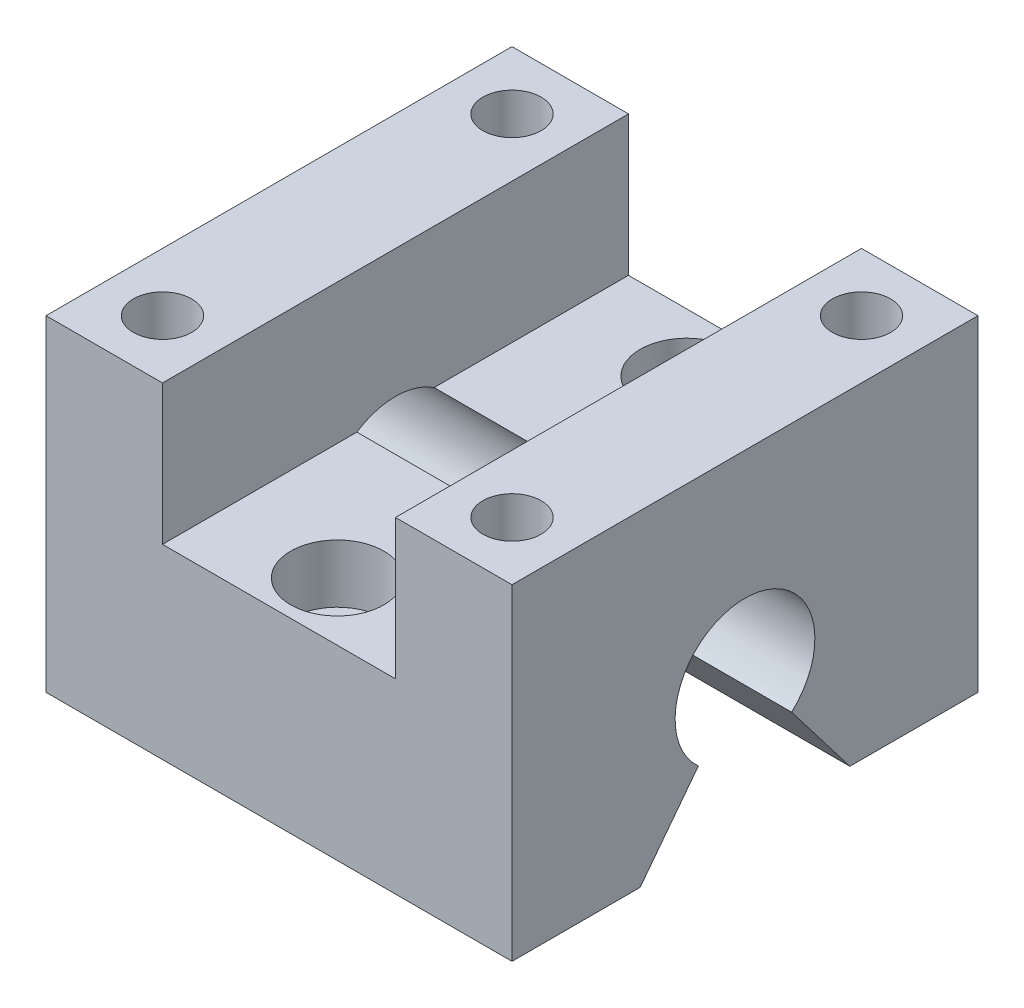
ISO-10303-21;
HEADER;
FILE_DESCRIPTION(('STEP AP214'),'2;1');
FILE_NAME('part.step','',(''),(''),'','','');
FILE_SCHEMA(('AUTOMOTIVE_DESIGN { 1 0 10303 214 1 1 1 1 }'));
ENDSEC;
DATA;
#1=APPLICATION_CONTEXT('core data for automotive mechanical design processes');
#2=APPLICATION_PROTOCOL_DEFINITION('international standard','automotive_design',2000,#1);
#3=PRODUCT_CONTEXT('',#1,'mechanical');
#4=PRODUCT('Part','Part','',(#3));
#5=PRODUCT_RELATED_PRODUCT_CATEGORY('part','',(#4));
#6=PRODUCT_DEFINITION_FORMATION('','',#4);
#7=PRODUCT_DEFINITION_CONTEXT('part definition',#1,'design');
#8=PRODUCT_DEFINITION('design','',#6,#7);
#9=PRODUCT_DEFINITION_SHAPE('','',#8);
#10=(LENGTH_UNIT() NAMED_UNIT(*) SI_UNIT(.MILLI.,.METRE.));
#11=(NAMED_UNIT(*) PLANE_ANGLE_UNIT() SI_UNIT($,.RADIAN.));
#12=(NAMED_UNIT(*) SI_UNIT($,.STERADIAN.) SOLID_ANGLE_UNIT());
#13=UNCERTAINTY_MEASURE_WITH_UNIT(LENGTH_MEASURE(1.E-05),#10,'distance_accuracy_value','');
#14=(GEOMETRIC_REPRESENTATION_CONTEXT(3) GLOBAL_UNCERTAINTY_ASSIGNED_CONTEXT((#13)) GLOBAL_UNIT_ASSIGNED_CONTEXT((#10,
#11,#12)) REPRESENTATION_CONTEXT('',''));
#15=CARTESIAN_POINT('',(0.,0.,0.));
#16=DIRECTION('',(0.,0.,1.));
#17=DIRECTION('',(1.,0.,0.));
#18=AXIS2_PLACEMENT_3D('',#15,#16,#17);
#19=CARTESIAN_POINT('',(20.,14.,20.));
#20=DIRECTION('',(0.,-1.,0.));
#21=DIRECTION('',(0.,0.,-1.));
#22=AXIS2_PLACEMENT_3D('',#19,#20,#21);
#23=PLANE('',#22);
#24=CARTESIAN_POINT('',(-15.,14.,14.9999999999999));
#25=DIRECTION('',(0.,1.,0.));
#26=DIRECTION('',(0.,0.,1.));
#27=AXIS2_PLACEMENT_3D('',#24,#25,#26);
#28=CIRCLE('',#27,2.5);
#29=CARTESIAN_POINT('',(-15.,14.,17.4999999999999));
#30=VERTEX_POINT('',#29);
#31=EDGE_CURVE('E423',#30,#30,#28,.T.);
#32=ORIENTED_EDGE('',*,*,#31,.F.);
#33=EDGE_LOOP('',(#32));
#34=FACE_BOUND('',#33,.T.);
#35=CARTESIAN_POINT('',(-14.9999999999999,14.,-15.));
#36=DIRECTION('',(0.,1.,0.));
#37=DIRECTION('',(0.,0.,1.));
#38=AXIS2_PLACEMENT_3D('',#35,#36,#37);
#39=CIRCLE('',#38,2.5);
#40=CARTESIAN_POINT('',(-14.9999999999999,14.,-12.5));
#41=VERTEX_POINT('',#40);
#42=EDGE_CURVE('E399',#41,#41,#39,.T.);
#43=ORIENTED_EDGE('',*,*,#42,.F.);
#44=EDGE_LOOP('',(#43));
#45=FACE_BOUND('',#44,.T.);
#46=DIRECTION('',(-1.,0.,0.));
#47=VECTOR('',#46,1.);
#48=CARTESIAN_POINT('',(20.,14.,20.));
#49=LINE('',#48,#47);
#50=CARTESIAN_POINT('',(-10.,14.,20.));
#51=VERTEX_POINT('',#50);
#52=CARTESIAN_POINT('',(-20.,14.,20.));
#53=VERTEX_POINT('',#52);
#54=EDGE_CURVE('E283',#51,#53,#49,.T.);
#55=ORIENTED_EDGE('',*,*,#54,.F.);
#56=DIRECTION('',(0.,0.,-1.));
#57=VECTOR('',#56,1.);
#58=CARTESIAN_POINT('',(-10.,14.,20.));
#59=LINE('',#58,#57);
#60=CARTESIAN_POINT('',(-9.99999999999988,14.,-20.));
#61=VERTEX_POINT('',#60);
#62=EDGE_CURVE('E204',#51,#61,#59,.T.);
#63=ORIENTED_EDGE('',*,*,#62,.T.);
#64=DIRECTION('',(-1.,0.,0.));
#65=VECTOR('',#64,1.);
#66=CARTESIAN_POINT('',(20.,14.,-20.));
#67=LINE('',#66,#65);
#68=CARTESIAN_POINT('',(-20.,14.,-20.));
#69=VERTEX_POINT('',#68);
#70=EDGE_CURVE('E286',#61,#69,#67,.T.);
#71=ORIENTED_EDGE('',*,*,#70,.T.);
#72=DIRECTION('',(0.,0.,1.));
#73=VECTOR('',#72,1.);
#74=CARTESIAN_POINT('',(-20.,14.,20.));
#75=LINE('',#74,#73);
#76=EDGE_CURVE('E239',#69,#53,#75,.T.);
#77=ORIENTED_EDGE('',*,*,#76,.T.);
#78=EDGE_LOOP('',(#55,#63,#71,#77));
#79=FACE_BOUND('',#78,.T.);
#80=ADVANCED_FACE('F54',(#34,#45,#79),#23,.F.);
#81=CARTESIAN_POINT('',(20.,-14.,-20.));
#82=DIRECTION('',(0.,0.,1.));
#83=DIRECTION('',(1.,0.,0.));
#84=AXIS2_PLACEMENT_3D('',#81,#82,#83);
#85=PLANE('',#84);
#86=ORIENTED_EDGE('',*,*,#70,.F.);
#87=DIRECTION('',(0.,-1.,0.));
#88=VECTOR('',#87,1.);
#89=CARTESIAN_POINT('',(-9.99999999999988,21.6163938280506,-20.));
#90=LINE('',#89,#88);
#91=CARTESIAN_POINT('',(-9.99999999999988,1.99999999999999,-20.));
#92=VERTEX_POINT('',#91);
#93=EDGE_CURVE('E182',#61,#92,#90,.T.);
#94=ORIENTED_EDGE('',*,*,#93,.T.);
#95=DIRECTION('',(1.,0.,0.));
#96=VECTOR('',#95,1.);
#97=CARTESIAN_POINT('',(-9.99999999999988,1.99999999999999,-20.));
#98=LINE('',#97,#96);
#99=CARTESIAN_POINT('',(10.0000000000001,1.99999999999999,-20.));
#100=VERTEX_POINT('',#99);
#101=EDGE_CURVE('E187',#92,#100,#98,.T.);
#102=ORIENTED_EDGE('',*,*,#101,.T.);
#103=DIRECTION('',(0.,1.,0.));
#104=VECTOR('',#103,1.);
#105=CARTESIAN_POINT('',(10.0000000000001,21.6163938280506,-20.));
#106=LINE('',#105,#104);
#107=CARTESIAN_POINT('',(10.0000000000001,14.,-20.));
#108=VERTEX_POINT('',#107);
#109=EDGE_CURVE('E194',#100,#108,#106,.T.);
#110=ORIENTED_EDGE('',*,*,#109,.T.);
#111=CARTESIAN_POINT('',(20.,14.,-20.));
#112=VERTEX_POINT('',#111);
#113=EDGE_CURVE('E287',#112,#108,#67,.T.);
#114=ORIENTED_EDGE('',*,*,#113,.F.);
#115=DIRECTION('',(0.,1.,0.));
#116=VECTOR('',#115,1.);
#117=CARTESIAN_POINT('',(20.,-14.,-20.));
#118=LINE('',#117,#116);
#119=CARTESIAN_POINT('',(20.,-14.,-20.));
#120=VERTEX_POINT('',#119);
#121=EDGE_CURVE('E209',#120,#112,#118,.T.);
#122=ORIENTED_EDGE('',*,*,#121,.F.);
#123=DIRECTION('',(-1.,0.,0.));
#124=VECTOR('',#123,1.);
#125=CARTESIAN_POINT('',(20.,-14.,-20.));
#126=LINE('',#125,#124);
#127=CARTESIAN_POINT('',(-20.,-14.,-20.));
#128=VERTEX_POINT('',#127);
#129=EDGE_CURVE('E235',#120,#128,#126,.T.);
#130=ORIENTED_EDGE('',*,*,#129,.T.);
#131=DIRECTION('',(0.,1.,0.));
#132=VECTOR('',#131,1.);
#133=CARTESIAN_POINT('',(-20.,-14.,-20.));
#134=LINE('',#133,#132);
#135=EDGE_CURVE('E208',#128,#69,#134,.T.);
#136=ORIENTED_EDGE('',*,*,#135,.T.);
#137=EDGE_LOOP('',(#86,#94,#102,#110,#114,#122,#130,#136));
#138=FACE_BOUND('',#137,.T.);
#139=ADVANCED_FACE('F56',(#138),#85,.F.);
#140=CARTESIAN_POINT('',(15.0000000000001,14.,-15.));
#141=DIRECTION('',(0.,1.,0.));
#142=DIRECTION('',(0.,0.,1.));
#143=AXIS2_PLACEMENT_3D('',#140,#141,#142);
#144=CIRCLE('',#143,2.49999999999999);
#145=CARTESIAN_POINT('',(15.0000000000001,14.,-12.5));
#146=VERTEX_POINT('',#145);
#147=EDGE_CURVE('E407',#146,#146,#144,.T.);
#148=ORIENTED_EDGE('',*,*,#147,.F.);
#149=EDGE_LOOP('',(#148));
#150=FACE_BOUND('',#149,.T.);
#151=CARTESIAN_POINT('',(15.,14.,14.9999999999999));
#152=DIRECTION('',(0.,1.,0.));
#153=DIRECTION('',(0.,0.,1.));
#154=AXIS2_PLACEMENT_3D('',#151,#152,#153);
#155=CIRCLE('',#154,2.49999999999999);
#156=CARTESIAN_POINT('',(15.,14.,17.4999999999999));
#157=VERTEX_POINT('',#156);
#158=EDGE_CURVE('E415',#157,#157,#155,.T.);
#159=ORIENTED_EDGE('',*,*,#158,.F.);
#160=EDGE_LOOP('',(#159));
#161=FACE_BOUND('',#160,.T.);
#162=ORIENTED_EDGE('',*,*,#113,.T.);
#163=DIRECTION('',(0.,0.,1.));
#164=VECTOR('',#163,1.);
#165=CARTESIAN_POINT('',(10.,14.,20.));
#166=LINE('',#165,#164);
#167=CARTESIAN_POINT('',(10.,14.,20.));
#168=VERTEX_POINT('',#167);
#169=EDGE_CURVE('E199',#108,#168,#166,.T.);
#170=ORIENTED_EDGE('',*,*,#169,.T.);
#171=CARTESIAN_POINT('',(20.,14.,20.));
#172=VERTEX_POINT('',#171);
#173=EDGE_CURVE('E180',#172,#168,#49,.T.);
#174=ORIENTED_EDGE('',*,*,#173,.F.);
#175=DIRECTION('',(0.,0.,1.));
#176=VECTOR('',#175,1.);
#177=CARTESIAN_POINT('',(20.,14.,20.));
#178=LINE('',#177,#176);
#179=EDGE_CURVE('E213',#112,#172,#178,.T.);
#180=ORIENTED_EDGE('',*,*,#179,.F.);
#181=EDGE_LOOP('',(#162,#170,#174,#180));
#182=FACE_BOUND('',#181,.T.);
#183=ADVANCED_FACE('F443',(#150,#161,#182),#23,.F.);
#184=CARTESIAN_POINT('',(20.,-14.,20.));
#185=DIRECTION('',(0.,0.,-1.));
#186=DIRECTION('',(0.,1.,0.));
#187=AXIS2_PLACEMENT_3D('',#184,#185,#186);
#188=PLANE('',#187);
#189=DIRECTION('',(1.,0.,0.));
#190=VECTOR('',#189,1.);
#191=CARTESIAN_POINT('',(-10.,1.99999999999996,20.));
#192=LINE('',#191,#190);
#193=CARTESIAN_POINT('',(-10.,1.99999999999996,20.));
#194=VERTEX_POINT('',#193);
#195=CARTESIAN_POINT('',(10.,1.99999999999996,20.));
#196=VERTEX_POINT('',#195);
#197=EDGE_CURVE('E169',#194,#196,#192,.T.);
#198=ORIENTED_EDGE('',*,*,#197,.F.);
#199=DIRECTION('',(0.,-1.,0.));
#200=VECTOR('',#199,1.);
#201=CARTESIAN_POINT('',(-10.,21.6163938280508,20.));
#202=LINE('',#201,#200);
#203=EDGE_CURVE('E174',#51,#194,#202,.T.);
#204=ORIENTED_EDGE('',*,*,#203,.F.);
#205=ORIENTED_EDGE('',*,*,#54,.T.);
#206=DIRECTION('',(0.,-1.,0.));
#207=VECTOR('',#206,1.);
#208=CARTESIAN_POINT('',(-20.,-14.,20.));
#209=LINE('',#208,#207);
#210=CARTESIAN_POINT('',(-20.,-14.,20.));
#211=VERTEX_POINT('',#210);
#212=EDGE_CURVE('E243',#53,#211,#209,.T.);
#213=ORIENTED_EDGE('',*,*,#212,.T.);
#214=DIRECTION('',(-1.,0.,0.));
#215=VECTOR('',#214,1.);
#216=CARTESIAN_POINT('',(20.,-14.,20.));
#217=LINE('',#216,#215);
#218=CARTESIAN_POINT('',(20.,-14.,20.));
#219=VERTEX_POINT('',#218);
#220=EDGE_CURVE('E279',#219,#211,#217,.T.);
#221=ORIENTED_EDGE('',*,*,#220,.F.);
#222=DIRECTION('',(0.,-1.,0.));
#223=VECTOR('',#222,1.);
#224=CARTESIAN_POINT('',(20.,-14.,20.));
#225=LINE('',#224,#223);
#226=EDGE_CURVE('E217',#172,#219,#225,.T.);
#227=ORIENTED_EDGE('',*,*,#226,.F.);
#228=ORIENTED_EDGE('',*,*,#173,.T.);
#229=DIRECTION('',(0.,1.,0.));
#230=VECTOR('',#229,1.);
#231=CARTESIAN_POINT('',(10.,21.6163938280508,20.));
#232=LINE('',#231,#230);
#233=EDGE_CURVE('E160',#196,#168,#232,.T.);
#234=ORIENTED_EDGE('',*,*,#233,.F.);
#235=EDGE_LOOP('',(#198,#204,#205,#213,#221,#227,#228,#234));
#236=FACE_BOUND('',#235,.T.);
#237=ADVANCED_FACE('F177',(#236),#188,.F.);
#238=CARTESIAN_POINT('',(20.,-14.,20.));
#239=DIRECTION('',(0.,1.,0.));
#240=DIRECTION('',(0.,0.,1.));
#241=AXIS2_PLACEMENT_3D('',#238,#239,#240);
#242=PLANE('',#241);
#243=DIRECTION('',(0.,0.,-1.));
#244=VECTOR('',#243,1.);
#245=CARTESIAN_POINT('',(-20.,-14.,20.));
#246=LINE('',#245,#244);
#247=CARTESIAN_POINT('',(-20.,-14.,9.));
#248=VERTEX_POINT('',#247);
#249=EDGE_CURVE('E246',#211,#248,#246,.T.);
#250=ORIENTED_EDGE('',*,*,#249,.T.);
#251=DIRECTION('',(-1.,0.,0.));
#252=VECTOR('',#251,1.);
#253=CARTESIAN_POINT('',(20.,-14.,9.));
#254=LINE('',#253,#252);
#255=CARTESIAN_POINT('',(20.,-14.,9.));
#256=VERTEX_POINT('',#255);
#257=EDGE_CURVE('E275',#256,#248,#254,.T.);
#258=ORIENTED_EDGE('',*,*,#257,.F.);
#259=DIRECTION('',(0.,0.,-1.));
#260=VECTOR('',#259,1.);
#261=CARTESIAN_POINT('',(20.,-14.,20.));
#262=LINE('',#261,#260);
#263=EDGE_CURVE('E220',#219,#256,#262,.T.);
#264=ORIENTED_EDGE('',*,*,#263,.F.);
#265=ORIENTED_EDGE('',*,*,#220,.T.);
#266=EDGE_LOOP('',(#250,#258,#264,#265));
#267=FACE_BOUND('',#266,.T.);
#268=ADVANCED_FACE('F376',(#267),#242,.F.);
#269=CARTESIAN_POINT('',(20.,-7.47213595499958,3.99999999999976));
#270=DIRECTION('',(0.,0.608071813200955,0.793882025234545));
#271=DIRECTION('',(0.,-0.793882025234545,0.608071813200955));
#272=AXIS2_PLACEMENT_3D('',#269,#270,#271);
#273=PLANE('',#272);
#274=DIRECTION('',(0.,0.793882025234545,-0.608071813200955));
#275=VECTOR('',#274,1.);
#276=CARTESIAN_POINT('',(-20.,-7.47213595499958,4.));
#277=LINE('',#276,#275);
#278=CARTESIAN_POINT('',(-20.,-7.47213595499958,4.));
#279=VERTEX_POINT('',#278);
#280=EDGE_CURVE('E249',#248,#279,#277,.T.);
#281=ORIENTED_EDGE('',*,*,#280,.T.);
#282=DIRECTION('',(-1.,0.,0.));
#283=VECTOR('',#282,1.);
#284=CARTESIAN_POINT('',(20.,-7.47213595499958,3.99999999999976));
#285=LINE('',#284,#283);
#286=CARTESIAN_POINT('',(20.,-7.47213595499958,3.99999999999976));
#287=VERTEX_POINT('',#286);
#288=EDGE_CURVE('E271',#287,#279,#285,.T.);
#289=ORIENTED_EDGE('',*,*,#288,.F.);
#290=DIRECTION('',(0.,0.793882025234545,-0.608071813200955));
#291=VECTOR('',#290,1.);
#292=CARTESIAN_POINT('',(20.,-7.47213595499958,3.99999999999976));
#293=LINE('',#292,#291);
#294=EDGE_CURVE('E223',#256,#287,#293,.T.);
#295=ORIENTED_EDGE('',*,*,#294,.F.);
#296=ORIENTED_EDGE('',*,*,#257,.T.);
#297=EDGE_LOOP('',(#281,#289,#295,#296));
#298=FACE_BOUND('',#297,.T.);
#299=ADVANCED_FACE('F373',(#298),#273,.F.);
#300=CARTESIAN_POINT('',(20.,-3.,-1.2490009027033E-13));
#301=DIRECTION('',(-1.,0.,0.));
#302=DIRECTION('',(0.,0.,1.));
#303=AXIS2_PLACEMENT_3D('',#300,#301,#302);
#304=CYLINDRICAL_SURFACE('',#303,6.);
#305=CARTESIAN_POINT('',(-10.,-3.,0.));
#306=DIRECTION('',(-1.,0.,0.));
#307=DIRECTION('',(0.,-1.,0.));
#308=AXIS2_PLACEMENT_3D('',#305,#306,#307);
#309=CIRCLE('',#308,6.);
#310=CARTESIAN_POINT('',(-10.,1.99999999999999,-3.31662479035542));
#311=VERTEX_POINT('',#310);
#312=CARTESIAN_POINT('',(-10.,1.99999999999999,3.31662479035541));
#313=VERTEX_POINT('',#312);
#314=EDGE_CURVE('E63',#311,#313,#309,.F.);
#315=ORIENTED_EDGE('',*,*,#314,.T.);
#316=DIRECTION('',(-1.,0.,0.));
#317=VECTOR('',#316,1.);
#318=CARTESIAN_POINT('',(20.,1.99999999999999,3.31662479035529));
#319=LINE('',#318,#317);
#320=CARTESIAN_POINT('',(10.,1.99999999999999,3.31662479035541));
#321=VERTEX_POINT('',#320);
#322=EDGE_CURVE('E13',#313,#321,#319,.F.);
#323=ORIENTED_EDGE('',*,*,#322,.T.);
#324=CARTESIAN_POINT('',(10.,-3.,-1.2490009027033E-13));
#325=DIRECTION('',(1.,0.,0.));
#326=DIRECTION('',(0.,1.,0.));
#327=AXIS2_PLACEMENT_3D('',#324,#325,#326);
#328=CIRCLE('',#327,6.);
#329=CARTESIAN_POINT('',(10.,1.99999999999999,-3.31662479035542));
#330=VERTEX_POINT('',#329);
#331=EDGE_CURVE('E164',#321,#330,#328,.F.);
#332=ORIENTED_EDGE('',*,*,#331,.T.);
#333=DIRECTION('',(-1.,0.,0.));
#334=VECTOR('',#333,1.);
#335=CARTESIAN_POINT('',(20.,1.99999999999999,-3.31662479035542));
#336=LINE('',#335,#334);
#337=EDGE_CURVE('E291',#330,#311,#336,.T.);
#338=ORIENTED_EDGE('',*,*,#337,.T.);
#339=EDGE_LOOP('',(#315,#323,#332,#338));
#340=FACE_BOUND('',#339,.T.);
#341=CARTESIAN_POINT('',(-20.,-3.,0.));
#342=DIRECTION('',(-1.,0.,0.));
#343=DIRECTION('',(0.,0.,-1.));
#344=AXIS2_PLACEMENT_3D('',#341,#342,#343);
#345=CIRCLE('',#344,6.);
#346=CARTESIAN_POINT('',(-20.,-7.47213595499958,-4.));
#347=VERTEX_POINT('',#346);
#348=EDGE_CURVE('E252',#279,#347,#345,.T.);
#349=ORIENTED_EDGE('',*,*,#348,.T.);
#350=DIRECTION('',(-1.,0.,0.));
#351=VECTOR('',#350,1.);
#352=CARTESIAN_POINT('',(20.,-7.47213595499958,-4.00000000000025));
#353=LINE('',#352,#351);
#354=CARTESIAN_POINT('',(20.,-7.47213595499958,-4.00000000000025));
#355=VERTEX_POINT('',#354);
#356=EDGE_CURVE('E267',#355,#347,#353,.T.);
#357=ORIENTED_EDGE('',*,*,#356,.F.);
#358=CARTESIAN_POINT('',(20.,-3.,-1.2490009027033E-13));
#359=DIRECTION('',(-1.,0.,0.));
#360=DIRECTION('',(0.,0.,-1.));
#361=AXIS2_PLACEMENT_3D('',#358,#359,#360);
#362=CIRCLE('',#361,6.);
#363=EDGE_CURVE('E226',#287,#355,#362,.T.);
#364=ORIENTED_EDGE('',*,*,#363,.F.);
#365=ORIENTED_EDGE('',*,*,#288,.T.);
#366=EDGE_LOOP('',(#349,#357,#364,#365));
#367=FACE_BOUND('',#366,.T.);
#368=ADVANCED_FACE('F300',(#340,#367),#304,.F.);
#369=CARTESIAN_POINT('',(20.,-7.47213595499958,-4.00000000000024));
#370=DIRECTION('',(0.,0.608071813200955,-0.793882025234545));
#371=DIRECTION('',(0.,0.793882025234545,0.608071813200955));
#372=AXIS2_PLACEMENT_3D('',#369,#370,#371);
#373=PLANE('',#372);
#374=DIRECTION('',(0.,-0.793882025234545,-0.608071813200955));
#375=VECTOR('',#374,1.);
#376=CARTESIAN_POINT('',(-20.,-7.47213595499958,-4.));
#377=LINE('',#376,#375);
#378=CARTESIAN_POINT('',(-20.,-14.,-9.));
#379=VERTEX_POINT('',#378);
#380=EDGE_CURVE('E255',#347,#379,#377,.T.);
#381=ORIENTED_EDGE('',*,*,#380,.T.);
#382=DIRECTION('',(-1.,0.,0.));
#383=VECTOR('',#382,1.);
#384=CARTESIAN_POINT('',(20.,-14.,-9.));
#385=LINE('',#384,#383);
#386=CARTESIAN_POINT('',(20.,-14.,-9.));
#387=VERTEX_POINT('',#386);
#388=EDGE_CURVE('E263',#387,#379,#385,.T.);
#389=ORIENTED_EDGE('',*,*,#388,.F.);
#390=DIRECTION('',(0.,-0.793882025234545,-0.608071813200955));
#391=VECTOR('',#390,1.);
#392=CARTESIAN_POINT('',(20.,-7.47213595499958,-4.00000000000024));
#393=LINE('',#392,#391);
#394=EDGE_CURVE('E229',#355,#387,#393,.T.);
#395=ORIENTED_EDGE('',*,*,#394,.F.);
#396=ORIENTED_EDGE('',*,*,#356,.T.);
#397=EDGE_LOOP('',(#381,#389,#395,#396));
#398=FACE_BOUND('',#397,.T.);
#399=ADVANCED_FACE('F366',(#398),#373,.F.);
#400=CARTESIAN_POINT('',(20.,-14.,-9.));
#401=DIRECTION('',(0.,1.,0.));
#402=DIRECTION('',(0.,0.,1.));
#403=AXIS2_PLACEMENT_3D('',#400,#401,#402);
#404=PLANE('',#403);
#405=DIRECTION('',(0.,0.,-1.));
#406=VECTOR('',#405,1.);
#407=CARTESIAN_POINT('',(-20.,-14.,-9.));
#408=LINE('',#407,#406);
#409=EDGE_CURVE('E214',#379,#128,#408,.T.);
#410=ORIENTED_EDGE('',*,*,#409,.T.);
#411=ORIENTED_EDGE('',*,*,#129,.F.);
#412=DIRECTION('',(0.,0.,-1.));
#413=VECTOR('',#412,1.);
#414=CARTESIAN_POINT('',(20.,-14.,-9.));
#415=LINE('',#414,#413);
#416=EDGE_CURVE('E232',#387,#120,#415,.T.);
#417=ORIENTED_EDGE('',*,*,#416,.F.);
#418=ORIENTED_EDGE('',*,*,#388,.T.);
#419=EDGE_LOOP('',(#410,#411,#417,#418));
#420=FACE_BOUND('',#419,.T.);
#421=ADVANCED_FACE('F360',(#420),#404,.F.);
#422=CARTESIAN_POINT('',(20.,-3.,-1.2490009027033E-13));
#423=DIRECTION('',(1.,0.,0.));
#424=DIRECTION('',(0.,0.,-1.));
#425=AXIS2_PLACEMENT_3D('',#422,#423,#424);
#426=PLANE('',#425);
#427=ORIENTED_EDGE('',*,*,#121,.T.);
#428=ORIENTED_EDGE('',*,*,#179,.T.);
#429=ORIENTED_EDGE('',*,*,#226,.T.);
#430=ORIENTED_EDGE('',*,*,#263,.T.);
#431=ORIENTED_EDGE('',*,*,#294,.T.);
#432=ORIENTED_EDGE('',*,*,#363,.T.);
#433=ORIENTED_EDGE('',*,*,#394,.T.);
#434=ORIENTED_EDGE('',*,*,#416,.T.);
#435=EDGE_LOOP('',(#427,#428,#429,#430,#431,#432,#433,#434));
#436=FACE_BOUND('',#435,.T.);
#437=ADVANCED_FACE('F488',(#436),#426,.T.);
#438=CARTESIAN_POINT('',(-20.,-3.,0.));
#439=DIRECTION('',(1.,0.,0.));
#440=DIRECTION('',(0.,0.,-1.));
#441=AXIS2_PLACEMENT_3D('',#438,#439,#440);
#442=PLANE('',#441);
#443=ORIENTED_EDGE('',*,*,#135,.F.);
#444=ORIENTED_EDGE('',*,*,#409,.F.);
#445=ORIENTED_EDGE('',*,*,#380,.F.);
#446=ORIENTED_EDGE('',*,*,#348,.F.);
#447=ORIENTED_EDGE('',*,*,#280,.F.);
#448=ORIENTED_EDGE('',*,*,#249,.F.);
#449=ORIENTED_EDGE('',*,*,#212,.F.);
#450=ORIENTED_EDGE('',*,*,#76,.F.);
#451=EDGE_LOOP('',(#443,#444,#445,#446,#447,#448,#449,#450));
#452=FACE_BOUND('',#451,.T.);
#453=ADVANCED_FACE('F352',(#452),#442,.F.);
#454=CARTESIAN_POINT('',(-9.99999999999988,21.6163938280506,-20.));
#455=DIRECTION('',(-1.,0.,0.));
#456=DIRECTION('',(0.,-1.,0.));
#457=AXIS2_PLACEMENT_3D('',#454,#455,#456);
#458=PLANE('',#457);
#459=ORIENTED_EDGE('',*,*,#203,.T.);
#460=DIRECTION('',(0.,0.,1.));
#461=VECTOR('',#460,1.);
#462=CARTESIAN_POINT('',(-9.99999999999988,1.99999999999999,-20.));
#463=LINE('',#462,#461);
#464=EDGE_CURVE('E70',#313,#194,#463,.T.);
#465=ORIENTED_EDGE('',*,*,#464,.F.);
#466=ORIENTED_EDGE('',*,*,#314,.F.);
#467=EDGE_CURVE('E78',#92,#311,#463,.T.);
#468=ORIENTED_EDGE('',*,*,#467,.F.);
#469=ORIENTED_EDGE('',*,*,#93,.F.);
#470=ORIENTED_EDGE('',*,*,#62,.F.);
#471=EDGE_LOOP('',(#459,#465,#466,#468,#469,#470));
#472=FACE_BOUND('',#471,.T.);
#473=ADVANCED_FACE('F303',(#472),#458,.F.);
#474=CARTESIAN_POINT('',(10.0000000000001,21.6163938280506,-20.));
#475=DIRECTION('',(1.,0.,0.));
#476=DIRECTION('',(0.,1.,0.));
#477=AXIS2_PLACEMENT_3D('',#474,#475,#476);
#478=PLANE('',#477);
#479=ORIENTED_EDGE('',*,*,#109,.F.);
#480=DIRECTION('',(0.,0.,1.));
#481=VECTOR('',#480,1.);
#482=CARTESIAN_POINT('',(10.0000000000001,1.99999999999999,-20.));
#483=LINE('',#482,#481);
#484=EDGE_CURVE('E166',#100,#330,#483,.T.);
#485=ORIENTED_EDGE('',*,*,#484,.T.);
#486=ORIENTED_EDGE('',*,*,#331,.F.);
#487=EDGE_CURVE('E156',#321,#196,#483,.T.);
#488=ORIENTED_EDGE('',*,*,#487,.T.);
#489=ORIENTED_EDGE('',*,*,#233,.T.);
#490=ORIENTED_EDGE('',*,*,#169,.F.);
#491=EDGE_LOOP('',(#479,#485,#486,#488,#489,#490));
#492=FACE_BOUND('',#491,.T.);
#493=ADVANCED_FACE('F158',(#492),#478,.F.);
#494=CARTESIAN_POINT('',(-9.99999999999988,1.99999999999999,-20.));
#495=DIRECTION('',(0.,-1.,0.));
#496=DIRECTION('',(0.,0.,-1.));
#497=AXIS2_PLACEMENT_3D('',#494,#495,#496);
#498=PLANE('',#497);
#499=CARTESIAN_POINT('',(0.,1.99999999999999,15.));
#500=DIRECTION('',(0.,1.,0.));
#501=DIRECTION('',(0.,0.,1.));
#502=AXIS2_PLACEMENT_3D('',#499,#500,#501);
#503=CIRCLE('',#502,4.);
#504=CARTESIAN_POINT('',(0.,1.99999999999999,19.));
#505=VERTEX_POINT('',#504);
#506=EDGE_CURVE('E387',#505,#505,#503,.T.);
#507=ORIENTED_EDGE('',*,*,#506,.F.);
#508=EDGE_LOOP('',(#507));
#509=FACE_BOUND('',#508,.T.);
#510=ORIENTED_EDGE('',*,*,#464,.T.);
#511=ORIENTED_EDGE('',*,*,#197,.T.);
#512=ORIENTED_EDGE('',*,*,#487,.F.);
#513=ORIENTED_EDGE('',*,*,#322,.F.);
#514=EDGE_LOOP('',(#510,#511,#512,#513));
#515=FACE_BOUND('',#514,.T.);
#516=ADVANCED_FACE('F170',(#509,#515),#498,.F.);
#517=CARTESIAN_POINT('',(0.,1.99999999999999,-15.));
#518=DIRECTION('',(0.,1.,0.));
#519=DIRECTION('',(0.,0.,1.));
#520=AXIS2_PLACEMENT_3D('',#517,#518,#519);
#521=CIRCLE('',#520,4.);
#522=CARTESIAN_POINT('',(0.,1.99999999999999,-11.));
#523=VERTEX_POINT('',#522);
#524=EDGE_CURVE('E384',#523,#523,#521,.T.);
#525=ORIENTED_EDGE('',*,*,#524,.F.);
#526=EDGE_LOOP('',(#525));
#527=FACE_BOUND('',#526,.T.);
#528=ORIENTED_EDGE('',*,*,#484,.F.);
#529=ORIENTED_EDGE('',*,*,#101,.F.);
#530=ORIENTED_EDGE('',*,*,#467,.T.);
#531=ORIENTED_EDGE('',*,*,#337,.F.);
#532=EDGE_LOOP('',(#528,#529,#530,#531));
#533=FACE_BOUND('',#532,.T.);
#534=ADVANCED_FACE('F471',(#527,#533),#498,.F.);
#535=CARTESIAN_POINT('',(0.,-3.00000000000001,-15.));
#536=DIRECTION('',(0.,1.,0.));
#537=DIRECTION('',(0.,0.,1.));
#538=AXIS2_PLACEMENT_3D('',#535,#536,#537);
#539=CYLINDRICAL_SURFACE('',#538,4.);
#540=CARTESIAN_POINT('',(0.,-3.00000000000001,-15.));
#541=DIRECTION('',(0.,1.,0.));
#542=DIRECTION('',(0.,0.,1.));
#543=AXIS2_PLACEMENT_3D('',#540,#541,#542);
#544=CIRCLE('',#543,4.);
#545=CARTESIAN_POINT('',(0.,-3.00000000000001,-11.));
#546=VERTEX_POINT('',#545);
#547=EDGE_CURVE('E380',#546,#546,#544,.T.);
#548=ORIENTED_EDGE('',*,*,#547,.F.);
#549=EDGE_LOOP('',(#548));
#550=FACE_BOUND('',#549,.T.);
#551=ORIENTED_EDGE('',*,*,#524,.T.);
#552=EDGE_LOOP('',(#551));
#553=FACE_BOUND('',#552,.T.);
#554=ADVANCED_FACE('F467',(#550,#553),#539,.F.);
#555=CARTESIAN_POINT('',(0.,-3.00000000000001,-15.));
#556=DIRECTION('',(0.,1.,0.));
#557=DIRECTION('',(0.,0.,1.));
#558=AXIS2_PLACEMENT_3D('',#555,#556,#557);
#559=PLANE('',#558);
#560=ORIENTED_EDGE('',*,*,#547,.T.);
#561=EDGE_LOOP('',(#560));
#562=FACE_BOUND('',#561,.T.);
#563=ADVANCED_FACE('F463',(#562),#559,.T.);
#564=CARTESIAN_POINT('',(0.,-3.00000000000001,14.9999999999999));
#565=DIRECTION('',(0.,1.,0.));
#566=DIRECTION('',(0.,0.,1.));
#567=AXIS2_PLACEMENT_3D('',#564,#565,#566);
#568=CYLINDRICAL_SURFACE('',#567,4.);
#569=CARTESIAN_POINT('',(0.,-3.00000000000001,14.9999999999999));
#570=DIRECTION('',(0.,1.,0.));
#571=DIRECTION('',(0.,0.,1.));
#572=AXIS2_PLACEMENT_3D('',#569,#570,#571);
#573=CIRCLE('',#572,4.);
#574=CARTESIAN_POINT('',(0.,-3.00000000000001,18.9999999999999));
#575=VERTEX_POINT('',#574);
#576=EDGE_CURVE('E391',#575,#575,#573,.T.);
#577=ORIENTED_EDGE('',*,*,#576,.F.);
#578=EDGE_LOOP('',(#577));
#579=FACE_BOUND('',#578,.T.);
#580=ORIENTED_EDGE('',*,*,#506,.T.);
#581=EDGE_LOOP('',(#580));
#582=FACE_BOUND('',#581,.T.);
#583=ADVANCED_FACE('F466',(#579,#582),#568,.F.);
#584=CARTESIAN_POINT('',(0.,-3.00000000000001,14.9999999999999));
#585=DIRECTION('',(0.,1.,0.));
#586=DIRECTION('',(0.,0.,1.));
#587=AXIS2_PLACEMENT_3D('',#584,#585,#586);
#588=PLANE('',#587);
#589=ORIENTED_EDGE('',*,*,#576,.T.);
#590=EDGE_LOOP('',(#589));
#591=FACE_BOUND('',#590,.T.);
#592=ADVANCED_FACE('F473',(#591),#588,.T.);
#593=CARTESIAN_POINT('',(15.,3.99999999999999,15.));
#594=DIRECTION('',(0.,1.,0.));
#595=DIRECTION('',(0.,0.,1.));
#596=AXIS2_PLACEMENT_3D('',#593,#594,#595);
#597=CYLINDRICAL_SURFACE('',#596,2.49999999999999);
#598=CARTESIAN_POINT('',(15.,3.99999999999999,15.));
#599=DIRECTION('',(0.,1.,0.));
#600=DIRECTION('',(0.,0.,1.));
#601=AXIS2_PLACEMENT_3D('',#598,#599,#600);
#602=CIRCLE('',#601,2.49999999999999);
#603=CARTESIAN_POINT('',(15.,3.99999999999999,17.5));
#604=VERTEX_POINT('',#603);
#605=EDGE_CURVE('E419',#604,#604,#602,.T.);
#606=ORIENTED_EDGE('',*,*,#605,.F.);
#607=EDGE_LOOP('',(#606));
#608=FACE_BOUND('',#607,.T.);
#609=ORIENTED_EDGE('',*,*,#158,.T.);
#610=EDGE_LOOP('',(#609));
#611=FACE_BOUND('',#610,.T.);
#612=ADVANCED_FACE('F476',(#608,#611),#597,.F.);
#613=CARTESIAN_POINT('',(15.,3.99999999999999,15.));
#614=DIRECTION('',(0.,1.,0.));
#615=DIRECTION('',(0.,0.,1.));
#616=AXIS2_PLACEMENT_3D('',#613,#614,#615);
#617=PLANE('',#616);
#618=ORIENTED_EDGE('',*,*,#605,.T.);
#619=EDGE_LOOP('',(#618));
#620=FACE_BOUND('',#619,.T.);
#621=ADVANCED_FACE('F544',(#620),#617,.T.);
#622=CARTESIAN_POINT('',(15.0000000000001,3.99999999999999,-15.));
#623=DIRECTION('',(0.,1.,0.));
#624=DIRECTION('',(0.,0.,1.));
#625=AXIS2_PLACEMENT_3D('',#622,#623,#624);
#626=CYLINDRICAL_SURFACE('',#625,2.49999999999999);
#627=CARTESIAN_POINT('',(15.0000000000001,3.99999999999999,-15.));
#628=DIRECTION('',(0.,1.,0.));
#629=DIRECTION('',(0.,0.,1.));
#630=AXIS2_PLACEMENT_3D('',#627,#628,#629);
#631=CIRCLE('',#630,2.49999999999999);
#632=CARTESIAN_POINT('',(15.0000000000001,3.99999999999999,-12.5));
#633=VERTEX_POINT('',#632);
#634=EDGE_CURVE('E411',#633,#633,#631,.T.);
#635=ORIENTED_EDGE('',*,*,#634,.F.);
#636=EDGE_LOOP('',(#635));
#637=FACE_BOUND('',#636,.T.);
#638=ORIENTED_EDGE('',*,*,#147,.T.);
#639=EDGE_LOOP('',(#638));
#640=FACE_BOUND('',#639,.T.);
#641=ADVANCED_FACE('F457',(#637,#640),#626,.F.);
#642=CARTESIAN_POINT('',(15.0000000000001,3.99999999999999,-15.));
#643=DIRECTION('',(0.,1.,0.));
#644=DIRECTION('',(0.,0.,1.));
#645=AXIS2_PLACEMENT_3D('',#642,#643,#644);
#646=PLANE('',#645);
#647=ORIENTED_EDGE('',*,*,#634,.T.);
#648=EDGE_LOOP('',(#647));
#649=FACE_BOUND('',#648,.T.);
#650=ADVANCED_FACE('F448',(#649),#646,.T.);
#651=CARTESIAN_POINT('',(-14.9999999999999,3.99999999999999,-15.));
#652=DIRECTION('',(0.,1.,0.));
#653=DIRECTION('',(0.,0.,1.));
#654=AXIS2_PLACEMENT_3D('',#651,#652,#653);
#655=CYLINDRICAL_SURFACE('',#654,2.5);
#656=CARTESIAN_POINT('',(-14.9999999999999,3.99999999999999,-15.));
#657=DIRECTION('',(0.,1.,0.));
#658=DIRECTION('',(0.,0.,1.));
#659=AXIS2_PLACEMENT_3D('',#656,#657,#658);
#660=CIRCLE('',#659,2.5);
#661=CARTESIAN_POINT('',(-14.9999999999999,3.99999999999999,-12.5));
#662=VERTEX_POINT('',#661);
#663=EDGE_CURVE('E392',#662,#662,#660,.T.);
#664=ORIENTED_EDGE('',*,*,#663,.F.);
#665=EDGE_LOOP('',(#664));
#666=FACE_BOUND('',#665,.T.);
#667=ORIENTED_EDGE('',*,*,#42,.T.);
#668=EDGE_LOOP('',(#667));
#669=FACE_BOUND('',#668,.T.);
#670=ADVANCED_FACE('F446',(#666,#669),#655,.F.);
#671=CARTESIAN_POINT('',(-14.9999999999999,3.99999999999999,-15.));
#672=DIRECTION('',(0.,1.,0.));
#673=DIRECTION('',(0.,0.,1.));
#674=AXIS2_PLACEMENT_3D('',#671,#672,#673);
#675=PLANE('',#674);
#676=ORIENTED_EDGE('',*,*,#663,.T.);
#677=EDGE_LOOP('',(#676));
#678=FACE_BOUND('',#677,.T.);
#679=ADVANCED_FACE('F437',(#678),#675,.T.);
#680=CARTESIAN_POINT('',(-15.,3.99999999999999,15.));
#681=DIRECTION('',(0.,1.,0.));
#682=DIRECTION('',(0.,0.,1.));
#683=AXIS2_PLACEMENT_3D('',#680,#681,#682);
#684=CYLINDRICAL_SURFACE('',#683,2.5);
#685=CARTESIAN_POINT('',(-15.,3.99999999999999,15.));
#686=DIRECTION('',(0.,1.,0.));
#687=DIRECTION('',(0.,0.,1.));
#688=AXIS2_PLACEMENT_3D('',#685,#686,#687);
#689=CIRCLE('',#688,2.5);
#690=CARTESIAN_POINT('',(-15.,3.99999999999999,17.5));
#691=VERTEX_POINT('',#690);
#692=EDGE_CURVE('E403',#691,#691,#689,.T.);
#693=ORIENTED_EDGE('',*,*,#692,.F.);
#694=EDGE_LOOP('',(#693));
#695=FACE_BOUND('',#694,.T.);
#696=ORIENTED_EDGE('',*,*,#31,.T.);
#697=EDGE_LOOP('',(#696));
#698=FACE_BOUND('',#697,.T.);
#699=ADVANCED_FACE('F434',(#695,#698),#684,.F.);
#700=CARTESIAN_POINT('',(-15.,3.99999999999999,15.));
#701=DIRECTION('',(0.,1.,0.));
#702=DIRECTION('',(0.,0.,1.));
#703=AXIS2_PLACEMENT_3D('',#700,#701,#702);
#704=PLANE('',#703);
#705=ORIENTED_EDGE('',*,*,#692,.T.);
#706=EDGE_LOOP('',(#705));
#707=FACE_BOUND('',#706,.T.);
#708=ADVANCED_FACE('F432',(#707),#704,.T.);
#709=CLOSED_SHELL('',(#80,#139,#183,#237,#268,#299,#368,#399,#421,#437,#453,#473,#493,#516,#534,
#554,#563,#583,#592,#612,#621,#641,#650,#670,#679,#699,#708));
#710=MANIFOLD_SOLID_BREP('B2',#709);
#711=ADVANCED_BREP_SHAPE_REPRESENTATION('',(#18,#710),#14);
#712=SHAPE_DEFINITION_REPRESENTATION(#9,#711);
ENDSEC;
END-ISO-10303-21;
